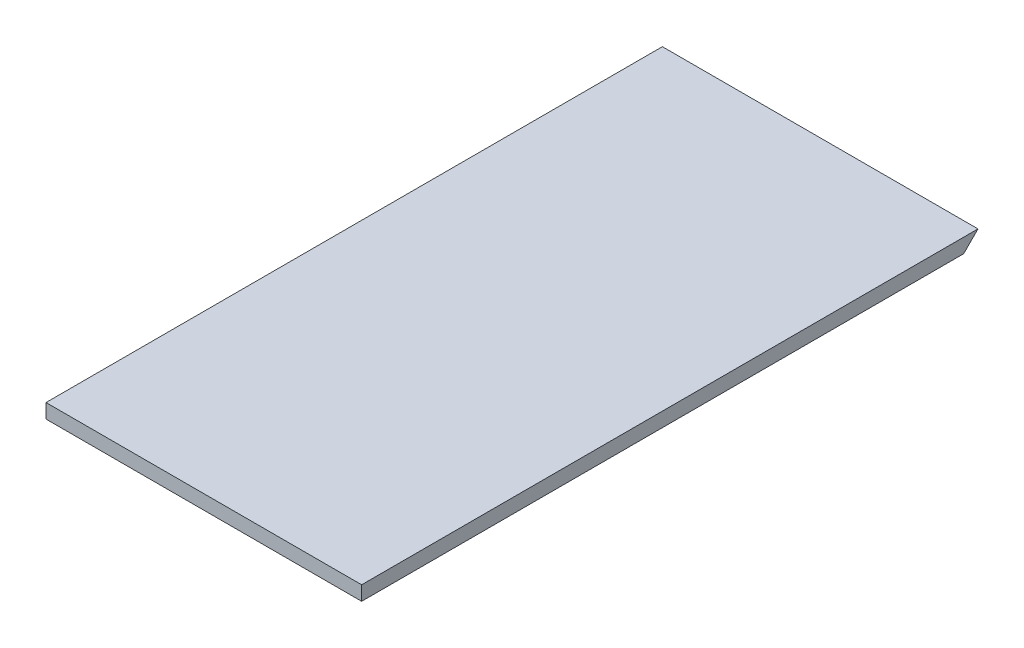
ISO-10303-21;
HEADER;
FILE_DESCRIPTION(('STEP AP214'),'2;1');
FILE_NAME('part.step','',(''),(''),'','','');
FILE_SCHEMA(('AUTOMOTIVE_DESIGN { 1 0 10303 214 1 1 1 1 }'));
ENDSEC;
DATA;
#1=APPLICATION_CONTEXT('core data for automotive mechanical design processes');
#2=APPLICATION_PROTOCOL_DEFINITION('international standard','automotive_design',2000,#1);
#3=PRODUCT_CONTEXT('',#1,'mechanical');
#4=PRODUCT('Part','Part','',(#3));
#5=PRODUCT_RELATED_PRODUCT_CATEGORY('part','',(#4));
#6=PRODUCT_DEFINITION_FORMATION('','',#4);
#7=PRODUCT_DEFINITION_CONTEXT('part definition',#1,'design');
#8=PRODUCT_DEFINITION('design','',#6,#7);
#9=PRODUCT_DEFINITION_SHAPE('','',#8);
#10=(LENGTH_UNIT() NAMED_UNIT(*) SI_UNIT(.MILLI.,.METRE.));
#11=(NAMED_UNIT(*) PLANE_ANGLE_UNIT() SI_UNIT($,.RADIAN.));
#12=(NAMED_UNIT(*) SI_UNIT($,.STERADIAN.) SOLID_ANGLE_UNIT());
#13=UNCERTAINTY_MEASURE_WITH_UNIT(LENGTH_MEASURE(1.E-05),#10,'distance_accuracy_value','');
#14=(GEOMETRIC_REPRESENTATION_CONTEXT(3) GLOBAL_UNCERTAINTY_ASSIGNED_CONTEXT((#13)) GLOBAL_UNIT_ASSIGNED_CONTEXT((#10,
#11,#12)) REPRESENTATION_CONTEXT('',''));
#15=CARTESIAN_POINT('',(0.,0.,0.));
#16=DIRECTION('',(0.,0.,1.));
#17=DIRECTION('',(1.,0.,0.));
#18=AXIS2_PLACEMENT_3D('',#15,#16,#17);
#19=CARTESIAN_POINT('',(279.4,0.,0.));
#20=DIRECTION('',(0.,1.,0.));
#21=DIRECTION('',(0.,0.,1.));
#22=AXIS2_PLACEMENT_3D('',#19,#20,#21);
#23=PLANE('',#22);
#24=DIRECTION('',(0.,0.,-1.));
#25=VECTOR('',#24,1.);
#26=CARTESIAN_POINT('',(0.,0.,0.));
#27=LINE('',#26,#25);
#28=CARTESIAN_POINT('',(0.,0.,0.));
#29=VERTEX_POINT('',#28);
#30=CARTESIAN_POINT('',(0.,0.,-532.892));
#31=VERTEX_POINT('',#30);
#32=EDGE_CURVE('E98',#29,#31,#27,.T.);
#33=ORIENTED_EDGE('',*,*,#32,.T.);
#34=DIRECTION('',(-1.,0.,0.));
#35=VECTOR('',#34,1.);
#36=CARTESIAN_POINT('',(279.4,0.,-532.892));
#37=LINE('',#36,#35);
#38=CARTESIAN_POINT('',(279.4,0.,-532.892));
#39=VERTEX_POINT('',#38);
#40=EDGE_CURVE('E11',#39,#31,#37,.T.);
#41=ORIENTED_EDGE('',*,*,#40,.F.);
#42=DIRECTION('',(0.,0.,-1.));
#43=VECTOR('',#42,1.);
#44=CARTESIAN_POINT('',(279.4,0.,0.));
#45=LINE('',#44,#43);
#46=CARTESIAN_POINT('',(279.4,0.,0.));
#47=VERTEX_POINT('',#46);
#48=EDGE_CURVE('E86',#47,#39,#45,.T.);
#49=ORIENTED_EDGE('',*,*,#48,.F.);
#50=DIRECTION('',(-1.,0.,0.));
#51=VECTOR('',#50,1.);
#52=CARTESIAN_POINT('',(279.4,0.,0.));
#53=LINE('',#52,#51);
#54=EDGE_CURVE('E94',#47,#29,#53,.T.);
#55=ORIENTED_EDGE('',*,*,#54,.T.);
#56=EDGE_LOOP('',(#33,#41,#49,#55));
#57=FACE_BOUND('',#56,.T.);
#58=ADVANCED_FACE('F35',(#57),#23,.F.);
#59=CARTESIAN_POINT('',(279.4,0.,-532.892));
#60=DIRECTION('',(0.,0.707106781186546,0.707106781186549));
#61=DIRECTION('',(0.,-0.707106781186549,0.707106781186546));
#62=AXIS2_PLACEMENT_3D('',#59,#60,#61);
#63=PLANE('',#62);
#64=DIRECTION('',(0.,0.707106781186549,-0.707106781186546));
#65=VECTOR('',#64,1.);
#66=CARTESIAN_POINT('',(0.,0.,-532.892));
#67=LINE('',#66,#65);
#68=CARTESIAN_POINT('',(0.,12.7,-545.592));
#69=VERTEX_POINT('',#68);
#70=EDGE_CURVE('E90',#31,#69,#67,.T.);
#71=ORIENTED_EDGE('',*,*,#70,.T.);
#72=DIRECTION('',(-1.,0.,0.));
#73=VECTOR('',#72,1.);
#74=CARTESIAN_POINT('',(279.4,12.7,-545.592));
#75=LINE('',#74,#73);
#76=CARTESIAN_POINT('',(279.4,12.7,-545.592));
#77=VERTEX_POINT('',#76);
#78=EDGE_CURVE('E43',#77,#69,#75,.T.);
#79=ORIENTED_EDGE('',*,*,#78,.F.);
#80=DIRECTION('',(0.,0.707106781186549,-0.707106781186546));
#81=VECTOR('',#80,1.);
#82=CARTESIAN_POINT('',(279.4,0.,-532.892));
#83=LINE('',#82,#81);
#84=EDGE_CURVE('E81',#39,#77,#83,.T.);
#85=ORIENTED_EDGE('',*,*,#84,.F.);
#86=ORIENTED_EDGE('',*,*,#40,.T.);
#87=EDGE_LOOP('',(#71,#79,#85,#86));
#88=FACE_BOUND('',#87,.T.);
#89=ADVANCED_FACE('F89',(#88),#63,.F.);
#90=CARTESIAN_POINT('',(279.4,12.7,0.));
#91=DIRECTION('',(0.,-1.,0.));
#92=DIRECTION('',(0.,0.,-1.));
#93=AXIS2_PLACEMENT_3D('',#90,#91,#92);
#94=PLANE('',#93);
#95=DIRECTION('',(0.,0.,1.));
#96=VECTOR('',#95,1.);
#97=CARTESIAN_POINT('',(0.,12.7,0.));
#98=LINE('',#97,#96);
#99=CARTESIAN_POINT('',(0.,12.7,0.));
#100=VERTEX_POINT('',#99);
#101=EDGE_CURVE('E68',#69,#100,#98,.T.);
#102=ORIENTED_EDGE('',*,*,#101,.T.);
#103=DIRECTION('',(-1.,0.,0.));
#104=VECTOR('',#103,1.);
#105=CARTESIAN_POINT('',(279.4,12.7,0.));
#106=LINE('',#105,#104);
#107=CARTESIAN_POINT('',(279.4,12.7,0.));
#108=VERTEX_POINT('',#107);
#109=EDGE_CURVE('E91',#108,#100,#106,.T.);
#110=ORIENTED_EDGE('',*,*,#109,.F.);
#111=DIRECTION('',(0.,0.,1.));
#112=VECTOR('',#111,1.);
#113=CARTESIAN_POINT('',(279.4,12.7,0.));
#114=LINE('',#113,#112);
#115=EDGE_CURVE('E84',#77,#108,#114,.T.);
#116=ORIENTED_EDGE('',*,*,#115,.F.);
#117=ORIENTED_EDGE('',*,*,#78,.T.);
#118=EDGE_LOOP('',(#102,#110,#116,#117));
#119=FACE_BOUND('',#118,.T.);
#120=ADVANCED_FACE('F92',(#119),#94,.F.);
#121=CARTESIAN_POINT('',(279.4,0.,0.));
#122=DIRECTION('',(0.,0.,-1.));
#123=DIRECTION('',(-1.,0.,0.));
#124=AXIS2_PLACEMENT_3D('',#121,#122,#123);
#125=PLANE('',#124);
#126=DIRECTION('',(0.,-1.,0.));
#127=VECTOR('',#126,1.);
#128=CARTESIAN_POINT('',(0.,0.,0.));
#129=LINE('',#128,#127);
#130=EDGE_CURVE('E74',#100,#29,#129,.T.);
#131=ORIENTED_EDGE('',*,*,#130,.T.);
#132=ORIENTED_EDGE('',*,*,#54,.F.);
#133=DIRECTION('',(0.,-1.,0.));
#134=VECTOR('',#133,1.);
#135=CARTESIAN_POINT('',(279.4,0.,0.));
#136=LINE('',#135,#134);
#137=EDGE_CURVE('E51',#108,#47,#136,.T.);
#138=ORIENTED_EDGE('',*,*,#137,.F.);
#139=ORIENTED_EDGE('',*,*,#109,.T.);
#140=EDGE_LOOP('',(#131,#132,#138,#139));
#141=FACE_BOUND('',#140,.T.);
#142=ADVANCED_FACE('F105',(#141),#125,.F.);
#143=CARTESIAN_POINT('',(279.4,0.,0.));
#144=DIRECTION('',(1.,0.,0.));
#145=DIRECTION('',(0.,0.,-1.));
#146=AXIS2_PLACEMENT_3D('',#143,#144,#145);
#147=PLANE('',#146);
#148=ORIENTED_EDGE('',*,*,#48,.T.);
#149=ORIENTED_EDGE('',*,*,#84,.T.);
#150=ORIENTED_EDGE('',*,*,#115,.T.);
#151=ORIENTED_EDGE('',*,*,#137,.T.);
#152=EDGE_LOOP('',(#148,#149,#150,#151));
#153=FACE_BOUND('',#152,.T.);
#154=ADVANCED_FACE('F82',(#153),#147,.T.);
#155=CARTESIAN_POINT('',(0.,0.,0.));
#156=DIRECTION('',(1.,0.,0.));
#157=DIRECTION('',(0.,0.,-1.));
#158=AXIS2_PLACEMENT_3D('',#155,#156,#157);
#159=PLANE('',#158);
#160=ORIENTED_EDGE('',*,*,#32,.F.);
#161=ORIENTED_EDGE('',*,*,#130,.F.);
#162=ORIENTED_EDGE('',*,*,#101,.F.);
#163=ORIENTED_EDGE('',*,*,#70,.F.);
#164=EDGE_LOOP('',(#160,#161,#162,#163));
#165=FACE_BOUND('',#164,.T.);
#166=ADVANCED_FACE('F108',(#165),#159,.F.);
#167=CLOSED_SHELL('',(#58,#89,#120,#142,#154,#166));
#168=MANIFOLD_SOLID_BREP('B2',#167);
#169=ADVANCED_BREP_SHAPE_REPRESENTATION('',(#18,#168),#14);
#170=SHAPE_DEFINITION_REPRESENTATION(#9,#169);
ENDSEC;
END-ISO-10303-21;
